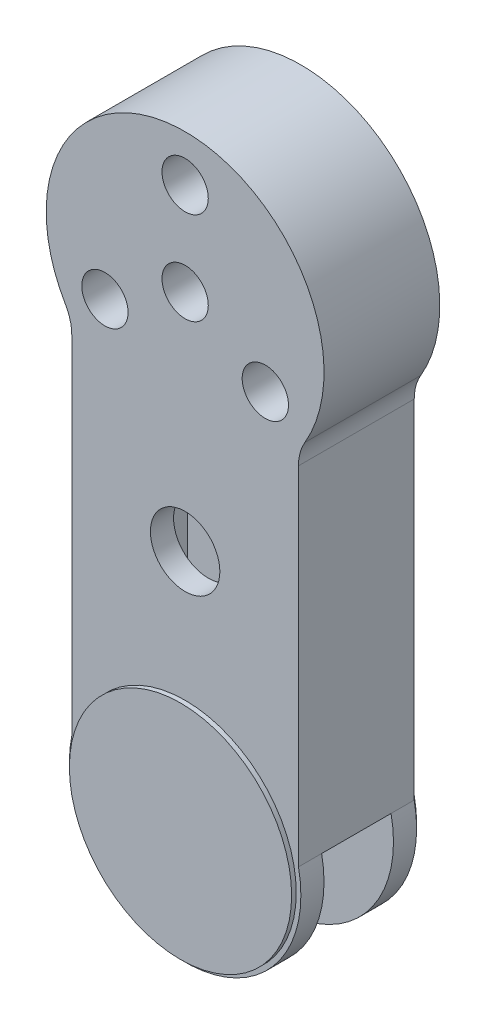
ISO-10303-21;
HEADER;
FILE_DESCRIPTION(('STEP AP214'),'2;1');
FILE_NAME('part.step','',(''),(''),'','','');
FILE_SCHEMA(('AUTOMOTIVE_DESIGN { 1 0 10303 214 1 1 1 1 }'));
ENDSEC;
DATA;
#1=APPLICATION_CONTEXT('core data for automotive mechanical design processes');
#2=APPLICATION_PROTOCOL_DEFINITION('international standard','automotive_design',2000,#1);
#3=PRODUCT_CONTEXT('',#1,'mechanical');
#4=PRODUCT('Part','Part','',(#3));
#5=PRODUCT_RELATED_PRODUCT_CATEGORY('part','',(#4));
#6=PRODUCT_DEFINITION_FORMATION('','',#4);
#7=PRODUCT_DEFINITION_CONTEXT('part definition',#1,'design');
#8=PRODUCT_DEFINITION('design','',#6,#7);
#9=PRODUCT_DEFINITION_SHAPE('','',#8);
#10=(LENGTH_UNIT() NAMED_UNIT(*) SI_UNIT(.MILLI.,.METRE.));
#11=(NAMED_UNIT(*) PLANE_ANGLE_UNIT() SI_UNIT($,.RADIAN.));
#12=(NAMED_UNIT(*) SI_UNIT($,.STERADIAN.) SOLID_ANGLE_UNIT());
#13=UNCERTAINTY_MEASURE_WITH_UNIT(LENGTH_MEASURE(1.E-05),#10,'distance_accuracy_value','');
#14=(GEOMETRIC_REPRESENTATION_CONTEXT(3) GLOBAL_UNCERTAINTY_ASSIGNED_CONTEXT((#13)) GLOBAL_UNIT_ASSIGNED_CONTEXT((#10,
#11,#12)) REPRESENTATION_CONTEXT('',''));
#15=CARTESIAN_POINT('',(0.,0.,0.));
#16=DIRECTION('',(0.,0.,1.));
#17=DIRECTION('',(1.,0.,0.));
#18=AXIS2_PLACEMENT_3D('',#15,#16,#17);
#19=CARTESIAN_POINT('',(0.,-200.720396700335,25.));
#20=DIRECTION('',(0.,0.,-1.));
#21=DIRECTION('',(-1.,0.,0.));
#22=AXIS2_PLACEMENT_3D('',#19,#20,#21);
#23=CYLINDRICAL_SURFACE('',#22,50.);
#24=CARTESIAN_POINT('',(0.,-200.720396700335,15.));
#25=DIRECTION('',(0.,0.,-1.));
#26=DIRECTION('',(-1.,0.,0.));
#27=AXIS2_PLACEMENT_3D('',#24,#25,#26);
#28=CIRCLE('',#27,50.);
#29=CARTESIAN_POINT('',(48.9615754368376,-190.583132239798,15.));
#30=VERTEX_POINT('',#29);
#31=CARTESIAN_POINT('',(-48.9615754368375,-190.583132239798,15.));
#32=VERTEX_POINT('',#31);
#33=EDGE_CURVE('E264',#30,#32,#28,.T.);
#34=ORIENTED_EDGE('',*,*,#33,.F.);
#35=DIRECTION('',(0.,0.,-1.));
#36=VECTOR('',#35,1.);
#37=CARTESIAN_POINT('',(48.9615754368376,-190.583132239798,25.));
#38=LINE('',#37,#36);
#39=CARTESIAN_POINT('',(48.9615754368376,-190.583132239798,25.));
#40=VERTEX_POINT('',#39);
#41=EDGE_CURVE('E153',#40,#30,#38,.T.);
#42=ORIENTED_EDGE('',*,*,#41,.F.);
#43=CARTESIAN_POINT('',(0.,-200.720396700335,25.));
#44=DIRECTION('',(0.,0.,1.));
#45=DIRECTION('',(-1.,0.,0.));
#46=AXIS2_PLACEMENT_3D('',#43,#44,#45);
#47=CIRCLE('',#46,50.);
#48=CARTESIAN_POINT('',(-48.9615754368375,-190.583132239798,25.));
#49=VERTEX_POINT('',#48);
#50=EDGE_CURVE('E115',#49,#40,#47,.T.);
#51=ORIENTED_EDGE('',*,*,#50,.F.);
#52=DIRECTION('',(0.,0.,-1.));
#53=VECTOR('',#52,1.);
#54=CARTESIAN_POINT('',(-48.9615754368375,-190.583132239798,25.));
#55=LINE('',#54,#53);
#56=EDGE_CURVE('E156',#49,#32,#55,.T.);
#57=ORIENTED_EDGE('',*,*,#56,.T.);
#58=EDGE_LOOP('',(#34,#42,#51,#57));
#59=FACE_BOUND('',#58,.T.);
#60=ADVANCED_FACE('F38',(#59),#23,.T.);
#61=CARTESIAN_POINT('',(-68.9615754368376,-40.549982900975,25.));
#62=DIRECTION('',(0.,0.,-1.));
#63=DIRECTION('',(-1.,0.,0.));
#64=AXIS2_PLACEMENT_3D('',#61,#62,#63);
#65=CYLINDRICAL_SURFACE('',#64,20.);
#66=CARTESIAN_POINT('',(-68.9615754368376,-40.549982900975,-25.));
#67=DIRECTION('',(0.,0.,-1.));
#68=DIRECTION('',(-1.,0.,0.));
#69=AXIS2_PLACEMENT_3D('',#66,#67,#68);
#70=CIRCLE('',#69,20.);
#71=CARTESIAN_POINT('',(-51.7211815776282,-30.4124871757312,-25.));
#72=VERTEX_POINT('',#71);
#73=CARTESIAN_POINT('',(-48.9615754368375,-40.549982900975,-25.));
#74=VERTEX_POINT('',#73);
#75=EDGE_CURVE('E136',#72,#74,#70,.T.);
#76=ORIENTED_EDGE('',*,*,#75,.T.);
#77=DIRECTION('',(0.,0.,-1.));
#78=VECTOR('',#77,1.);
#79=CARTESIAN_POINT('',(-48.9615754368375,-40.549982900975,25.));
#80=LINE('',#79,#78);
#81=CARTESIAN_POINT('',(-48.9615754368375,-40.549982900975,25.));
#82=VERTEX_POINT('',#81);
#83=EDGE_CURVE('E159',#82,#74,#80,.T.);
#84=ORIENTED_EDGE('',*,*,#83,.F.);
#85=CARTESIAN_POINT('',(-68.9615754368376,-40.549982900975,25.));
#86=DIRECTION('',(0.,0.,-1.));
#87=DIRECTION('',(-1.,0.,0.));
#88=AXIS2_PLACEMENT_3D('',#85,#86,#87);
#89=CIRCLE('',#88,20.);
#90=CARTESIAN_POINT('',(-51.7211815776282,-30.4124871757312,25.));
#91=VERTEX_POINT('',#90);
#92=EDGE_CURVE('E150',#91,#82,#89,.T.);
#93=ORIENTED_EDGE('',*,*,#92,.F.);
#94=DIRECTION('',(0.,0.,-1.));
#95=VECTOR('',#94,1.);
#96=CARTESIAN_POINT('',(-51.7211815776282,-30.4124871757312,25.));
#97=LINE('',#96,#95);
#98=EDGE_CURVE('E132',#91,#72,#97,.T.);
#99=ORIENTED_EDGE('',*,*,#98,.T.);
#100=EDGE_LOOP('',(#76,#84,#93,#99));
#101=FACE_BOUND('',#100,.T.);
#102=ADVANCED_FACE('F40',(#101),#65,.F.);
#103=CARTESIAN_POINT('',(-48.9615754368375,-40.549982900975,25.));
#104=DIRECTION('',(1.,0.,0.));
#105=DIRECTION('',(0.,0.,-1.));
#106=AXIS2_PLACEMENT_3D('',#103,#104,#105);
#107=PLANE('',#106);
#108=DIRECTION('',(0.,-1.,0.));
#109=VECTOR('',#108,1.);
#110=CARTESIAN_POINT('',(-48.9615754368375,-40.549982900975,-25.));
#111=LINE('',#110,#109);
#112=CARTESIAN_POINT('',(-48.9615754368375,-190.583132239798,-25.));
#113=VERTEX_POINT('',#112);
#114=EDGE_CURVE('E139',#74,#113,#111,.T.);
#115=ORIENTED_EDGE('',*,*,#114,.T.);
#116=CARTESIAN_POINT('',(-48.9615754368375,-190.583132239798,-15.));
#117=VERTEX_POINT('',#116);
#118=EDGE_CURVE('E155',#117,#113,#55,.T.);
#119=ORIENTED_EDGE('',*,*,#118,.F.);
#120=DIRECTION('',(0.,0.,1.));
#121=VECTOR('',#120,1.);
#122=CARTESIAN_POINT('',(-48.9615754368375,-190.583132239798,-15.));
#123=LINE('',#122,#121);
#124=EDGE_CURVE('E267',#117,#32,#123,.T.);
#125=ORIENTED_EDGE('',*,*,#124,.T.);
#126=ORIENTED_EDGE('',*,*,#56,.F.);
#127=DIRECTION('',(0.,-1.,0.));
#128=VECTOR('',#127,1.);
#129=CARTESIAN_POINT('',(-48.9615754368375,-40.549982900975,25.));
#130=LINE('',#129,#128);
#131=EDGE_CURVE('E98',#82,#49,#130,.T.);
#132=ORIENTED_EDGE('',*,*,#131,.F.);
#133=ORIENTED_EDGE('',*,*,#83,.T.);
#134=EDGE_LOOP('',(#115,#119,#125,#126,#132,#133));
#135=FACE_BOUND('',#134,.T.);
#136=ADVANCED_FACE('F297',(#135),#107,.F.);
#137=CARTESIAN_POINT('',(48.9615754368376,-190.583132239798,-15.));
#138=VERTEX_POINT('',#137);
#139=CARTESIAN_POINT('',(48.9615754368376,-190.583132239798,-25.));
#140=VERTEX_POINT('',#139);
#141=EDGE_CURVE('E127',#138,#140,#38,.T.);
#142=ORIENTED_EDGE('',*,*,#141,.F.);
#143=CARTESIAN_POINT('',(0.,-200.720396700335,-15.));
#144=DIRECTION('',(0.,0.,-1.));
#145=DIRECTION('',(-1.,0.,0.));
#146=AXIS2_PLACEMENT_3D('',#143,#144,#145);
#147=CIRCLE('',#146,50.);
#148=EDGE_CURVE('E140',#138,#117,#147,.T.);
#149=ORIENTED_EDGE('',*,*,#148,.T.);
#150=ORIENTED_EDGE('',*,*,#118,.T.);
#151=CARTESIAN_POINT('',(0.,-200.720396700335,-25.));
#152=DIRECTION('',(0.,0.,1.));
#153=DIRECTION('',(-1.,0.,0.));
#154=AXIS2_PLACEMENT_3D('',#151,#152,#153);
#155=CIRCLE('',#154,50.);
#156=EDGE_CURVE('E143',#113,#140,#155,.T.);
#157=ORIENTED_EDGE('',*,*,#156,.T.);
#158=EDGE_LOOP('',(#142,#149,#150,#157));
#159=FACE_BOUND('',#158,.T.);
#160=ADVANCED_FACE('F359',(#159),#23,.T.);
#161=CARTESIAN_POINT('',(48.9615754368376,-40.549982900975,25.));
#162=DIRECTION('',(-1.,0.,0.));
#163=DIRECTION('',(0.,0.,1.));
#164=AXIS2_PLACEMENT_3D('',#161,#162,#163);
#165=PLANE('',#164);
#166=DIRECTION('',(0.,1.,0.));
#167=VECTOR('',#166,1.);
#168=CARTESIAN_POINT('',(48.9615754368376,-40.549982900975,-25.));
#169=LINE('',#168,#167);
#170=CARTESIAN_POINT('',(48.9615754368376,-40.549982900975,-25.));
#171=VERTEX_POINT('',#170);
#172=EDGE_CURVE('E124',#140,#171,#169,.T.);
#173=ORIENTED_EDGE('',*,*,#172,.T.);
#174=DIRECTION('',(0.,0.,-1.));
#175=VECTOR('',#174,1.);
#176=CARTESIAN_POINT('',(48.9615754368376,-40.549982900975,25.));
#177=LINE('',#176,#175);
#178=CARTESIAN_POINT('',(48.9615754368376,-40.549982900975,25.));
#179=VERTEX_POINT('',#178);
#180=EDGE_CURVE('E121',#179,#171,#177,.T.);
#181=ORIENTED_EDGE('',*,*,#180,.F.);
#182=DIRECTION('',(0.,1.,0.));
#183=VECTOR('',#182,1.);
#184=CARTESIAN_POINT('',(48.9615754368376,-40.549982900975,25.));
#185=LINE('',#184,#183);
#186=EDGE_CURVE('E108',#40,#179,#185,.T.);
#187=ORIENTED_EDGE('',*,*,#186,.F.);
#188=ORIENTED_EDGE('',*,*,#41,.T.);
#189=DIRECTION('',(0.,0.,1.));
#190=VECTOR('',#189,1.);
#191=CARTESIAN_POINT('',(48.9615754368376,-190.583132239798,-15.));
#192=LINE('',#191,#190);
#193=EDGE_CURVE('E265',#138,#30,#192,.T.);
#194=ORIENTED_EDGE('',*,*,#193,.F.);
#195=ORIENTED_EDGE('',*,*,#141,.T.);
#196=EDGE_LOOP('',(#173,#181,#187,#188,#194,#195));
#197=FACE_BOUND('',#196,.T.);
#198=ADVANCED_FACE('F122',(#197),#165,.F.);
#199=CARTESIAN_POINT('',(68.9615754368376,-40.549982900975,25.));
#200=DIRECTION('',(0.,0.,-1.));
#201=DIRECTION('',(-1.,0.,0.));
#202=AXIS2_PLACEMENT_3D('',#199,#200,#201);
#203=CYLINDRICAL_SURFACE('',#202,20.);
#204=CARTESIAN_POINT('',(68.9615754368376,-40.549982900975,-25.));
#205=DIRECTION('',(0.,0.,-1.));
#206=DIRECTION('',(1.,0.,0.));
#207=AXIS2_PLACEMENT_3D('',#204,#205,#206);
#208=CIRCLE('',#207,20.);
#209=CARTESIAN_POINT('',(51.7211815776282,-30.4124871757312,-25.));
#210=VERTEX_POINT('',#209);
#211=EDGE_CURVE('E147',#171,#210,#208,.T.);
#212=ORIENTED_EDGE('',*,*,#211,.T.);
#213=DIRECTION('',(0.,0.,-1.));
#214=VECTOR('',#213,1.);
#215=CARTESIAN_POINT('',(51.7211815776282,-30.4124871757312,25.));
#216=LINE('',#215,#214);
#217=CARTESIAN_POINT('',(51.7211815776282,-30.4124871757312,25.));
#218=VERTEX_POINT('',#217);
#219=EDGE_CURVE('E128',#218,#210,#216,.T.);
#220=ORIENTED_EDGE('',*,*,#219,.F.);
#221=CARTESIAN_POINT('',(68.9615754368376,-40.549982900975,25.));
#222=DIRECTION('',(0.,0.,-1.));
#223=DIRECTION('',(1.,0.,0.));
#224=AXIS2_PLACEMENT_3D('',#221,#222,#223);
#225=CIRCLE('',#224,20.);
#226=EDGE_CURVE('E112',#179,#218,#225,.T.);
#227=ORIENTED_EDGE('',*,*,#226,.F.);
#228=ORIENTED_EDGE('',*,*,#180,.T.);
#229=EDGE_LOOP('',(#212,#220,#227,#228));
#230=FACE_BOUND('',#229,.T.);
#231=ADVANCED_FACE('F130',(#230),#203,.F.);
#232=CARTESIAN_POINT('',(0.,0.,25.));
#233=DIRECTION('',(0.,0.,-1.));
#234=DIRECTION('',(-1.,0.,0.));
#235=AXIS2_PLACEMENT_3D('',#232,#233,#234);
#236=CYLINDRICAL_SURFACE('',#235,60.);
#237=CARTESIAN_POINT('',(0.,0.,-25.));
#238=DIRECTION('',(0.,0.,1.));
#239=DIRECTION('',(1.,0.,0.));
#240=AXIS2_PLACEMENT_3D('',#237,#238,#239);
#241=CIRCLE('',#240,60.);
#242=EDGE_CURVE('E89',#210,#72,#241,.T.);
#243=ORIENTED_EDGE('',*,*,#242,.T.);
#244=ORIENTED_EDGE('',*,*,#98,.F.);
#245=CARTESIAN_POINT('',(0.,0.,25.));
#246=DIRECTION('',(0.,0.,1.));
#247=DIRECTION('',(1.,0.,0.));
#248=AXIS2_PLACEMENT_3D('',#245,#246,#247);
#249=CIRCLE('',#248,60.);
#250=EDGE_CURVE('E62',#218,#91,#249,.T.);
#251=ORIENTED_EDGE('',*,*,#250,.F.);
#252=ORIENTED_EDGE('',*,*,#219,.T.);
#253=EDGE_LOOP('',(#243,#244,#251,#252));
#254=FACE_BOUND('',#253,.T.);
#255=ADVANCED_FACE('F364',(#254),#236,.T.);
#256=CARTESIAN_POINT('',(-68.9615754368376,-40.549982900975,25.));
#257=DIRECTION('',(0.,0.,-1.));
#258=DIRECTION('',(-1.,0.,0.));
#259=AXIS2_PLACEMENT_3D('',#256,#257,#258);
#260=PLANE('',#259);
#261=CARTESIAN_POINT('',(0.,-97.0611570923179,25.));
#262=DIRECTION('',(0.,0.,1.));
#263=DIRECTION('',(1.,0.,0.));
#264=AXIS2_PLACEMENT_3D('',#261,#262,#263);
#265=CIRCLE('',#264,15.);
#266=CARTESIAN_POINT('',(15.,-97.0611570923179,25.));
#267=VERTEX_POINT('',#266);
#268=EDGE_CURVE('E165',#267,#267,#265,.T.);
#269=ORIENTED_EDGE('',*,*,#268,.F.);
#270=EDGE_LOOP('',(#269));
#271=FACE_BOUND('',#270,.T.);
#272=CARTESIAN_POINT('',(0.,-200.720396700335,25.));
#273=DIRECTION('',(0.,0.,-1.));
#274=DIRECTION('',(-1.,0.,0.));
#275=AXIS2_PLACEMENT_3D('',#272,#273,#274);
#276=CIRCLE('',#275,48.);
#277=CARTESIAN_POINT('',(-48.,-200.720396700335,25.));
#278=VERTEX_POINT('',#277);
#279=EDGE_CURVE('E46',#278,#278,#276,.F.);
#280=ORIENTED_EDGE('',*,*,#279,.F.);
#281=EDGE_LOOP('',(#280));
#282=FACE_BOUND('',#281,.T.);
#283=CARTESIAN_POINT('',(34.6410161513774,-20.0000000000002,25.));
#284=DIRECTION('',(0.,0.,1.));
#285=DIRECTION('',(1.,0.,0.));
#286=AXIS2_PLACEMENT_3D('',#283,#284,#285);
#287=CIRCLE('',#286,10.);
#288=CARTESIAN_POINT('',(44.6410161513774,-20.0000000000002,25.));
#289=VERTEX_POINT('',#288);
#290=EDGE_CURVE('E185',#289,#289,#287,.T.);
#291=ORIENTED_EDGE('',*,*,#290,.F.);
#292=EDGE_LOOP('',(#291));
#293=FACE_BOUND('',#292,.T.);
#294=CARTESIAN_POINT('',(0.,40.,25.));
#295=DIRECTION('',(0.,0.,1.));
#296=DIRECTION('',(1.,0.,0.));
#297=AXIS2_PLACEMENT_3D('',#294,#295,#296);
#298=CIRCLE('',#297,10.);
#299=CARTESIAN_POINT('',(10.,40.,25.));
#300=VERTEX_POINT('',#299);
#301=EDGE_CURVE('E192',#300,#300,#298,.T.);
#302=ORIENTED_EDGE('',*,*,#301,.F.);
#303=EDGE_LOOP('',(#302));
#304=FACE_BOUND('',#303,.T.);
#305=CARTESIAN_POINT('',(-34.6410161513774,-20.0000000000002,25.));
#306=DIRECTION('',(0.,0.,1.));
#307=DIRECTION('',(1.,0.,0.));
#308=AXIS2_PLACEMENT_3D('',#305,#306,#307);
#309=CIRCLE('',#308,10.);
#310=CARTESIAN_POINT('',(-24.6410161513774,-20.0000000000002,25.));
#311=VERTEX_POINT('',#310);
#312=EDGE_CURVE('E198',#311,#311,#309,.T.);
#313=ORIENTED_EDGE('',*,*,#312,.F.);
#314=EDGE_LOOP('',(#313));
#315=FACE_BOUND('',#314,.T.);
#316=CARTESIAN_POINT('',(0.,0.,25.));
#317=DIRECTION('',(0.,0.,1.));
#318=DIRECTION('',(1.,0.,0.));
#319=AXIS2_PLACEMENT_3D('',#316,#317,#318);
#320=CIRCLE('',#319,10.);
#321=CARTESIAN_POINT('',(10.,0.,25.));
#322=VERTEX_POINT('',#321);
#323=EDGE_CURVE('E188',#322,#322,#320,.T.);
#324=ORIENTED_EDGE('',*,*,#323,.F.);
#325=EDGE_LOOP('',(#324));
#326=FACE_BOUND('',#325,.T.);
#327=ORIENTED_EDGE('',*,*,#92,.T.);
#328=ORIENTED_EDGE('',*,*,#131,.T.);
#329=ORIENTED_EDGE('',*,*,#50,.T.);
#330=ORIENTED_EDGE('',*,*,#186,.T.);
#331=ORIENTED_EDGE('',*,*,#226,.T.);
#332=ORIENTED_EDGE('',*,*,#250,.T.);
#333=EDGE_LOOP('',(#327,#328,#329,#330,#331,#332));
#334=FACE_BOUND('',#333,.T.);
#335=ADVANCED_FACE('F110',(#271,#282,#293,#304,#315,#326,#334),#260,.F.);
#336=CARTESIAN_POINT('',(-68.9615754368376,-40.549982900975,-25.));
#337=DIRECTION('',(0.,0.,-1.));
#338=DIRECTION('',(-1.,0.,0.));
#339=AXIS2_PLACEMENT_3D('',#336,#337,#338);
#340=PLANE('',#339);
#341=CARTESIAN_POINT('',(0.,-200.720396700335,-25.));
#342=DIRECTION('',(0.,0.,-1.));
#343=DIRECTION('',(-1.,0.,0.));
#344=AXIS2_PLACEMENT_3D('',#341,#342,#343);
#345=CIRCLE('',#344,48.);
#346=CARTESIAN_POINT('',(-48.,-200.720396700335,-25.));
#347=VERTEX_POINT('',#346);
#348=EDGE_CURVE('E164',#347,#347,#345,.T.);
#349=ORIENTED_EDGE('',*,*,#348,.F.);
#350=EDGE_LOOP('',(#349));
#351=FACE_BOUND('',#350,.T.);
#352=CARTESIAN_POINT('',(34.6410161513774,-20.0000000000002,-25.));
#353=DIRECTION('',(0.,0.,1.));
#354=DIRECTION('',(1.,0.,0.));
#355=AXIS2_PLACEMENT_3D('',#352,#353,#354);
#356=CIRCLE('',#355,10.);
#357=CARTESIAN_POINT('',(44.6410161513774,-20.0000000000002,-25.));
#358=VERTEX_POINT('',#357);
#359=EDGE_CURVE('E189',#358,#358,#356,.T.);
#360=ORIENTED_EDGE('',*,*,#359,.T.);
#361=EDGE_LOOP('',(#360));
#362=FACE_BOUND('',#361,.T.);
#363=CARTESIAN_POINT('',(0.,40.,-25.));
#364=DIRECTION('',(0.,0.,1.));
#365=DIRECTION('',(1.,0.,0.));
#366=AXIS2_PLACEMENT_3D('',#363,#364,#365);
#367=CIRCLE('',#366,10.);
#368=CARTESIAN_POINT('',(10.,40.,-25.));
#369=VERTEX_POINT('',#368);
#370=EDGE_CURVE('E195',#369,#369,#367,.T.);
#371=ORIENTED_EDGE('',*,*,#370,.T.);
#372=EDGE_LOOP('',(#371));
#373=FACE_BOUND('',#372,.T.);
#374=CARTESIAN_POINT('',(-34.6410161513774,-20.0000000000002,-25.));
#375=DIRECTION('',(0.,0.,1.));
#376=DIRECTION('',(1.,0.,0.));
#377=AXIS2_PLACEMENT_3D('',#374,#375,#376);
#378=CIRCLE('',#377,10.);
#379=CARTESIAN_POINT('',(-24.6410161513774,-20.0000000000002,-25.));
#380=VERTEX_POINT('',#379);
#381=EDGE_CURVE('E184',#380,#380,#378,.T.);
#382=ORIENTED_EDGE('',*,*,#381,.T.);
#383=EDGE_LOOP('',(#382));
#384=FACE_BOUND('',#383,.T.);
#385=CARTESIAN_POINT('',(0.,0.,-25.));
#386=DIRECTION('',(0.,0.,1.));
#387=DIRECTION('',(1.,0.,0.));
#388=AXIS2_PLACEMENT_3D('',#385,#386,#387);
#389=CIRCLE('',#388,10.);
#390=CARTESIAN_POINT('',(10.,0.,-25.));
#391=VERTEX_POINT('',#390);
#392=EDGE_CURVE('E203',#391,#391,#389,.T.);
#393=ORIENTED_EDGE('',*,*,#392,.T.);
#394=EDGE_LOOP('',(#393));
#395=FACE_BOUND('',#394,.T.);
#396=ORIENTED_EDGE('',*,*,#75,.F.);
#397=ORIENTED_EDGE('',*,*,#242,.F.);
#398=ORIENTED_EDGE('',*,*,#211,.F.);
#399=ORIENTED_EDGE('',*,*,#172,.F.);
#400=ORIENTED_EDGE('',*,*,#156,.F.);
#401=ORIENTED_EDGE('',*,*,#114,.F.);
#402=EDGE_LOOP('',(#396,#397,#398,#399,#400,#401));
#403=FACE_BOUND('',#402,.T.);
#404=ADVANCED_FACE('F363',(#351,#362,#373,#384,#395,#403),#340,.T.);
#405=CARTESIAN_POINT('',(58.9615754368376,-172.298860992336,-15.));
#406=DIRECTION('',(0.,0.,-1.));
#407=DIRECTION('',(-1.,0.,0.));
#408=AXIS2_PLACEMENT_3D('',#405,#406,#407);
#409=PLANE('',#408);
#410=CARTESIAN_POINT('',(0.,-200.720396700335,-15.));
#411=DIRECTION('',(0.,0.,-1.));
#412=DIRECTION('',(-1.,0.,0.));
#413=AXIS2_PLACEMENT_3D('',#410,#411,#412);
#414=CIRCLE('',#413,10.);
#415=CARTESIAN_POINT('',(-10.,-200.720396700335,-15.));
#416=VERTEX_POINT('',#415);
#417=EDGE_CURVE('E11',#416,#416,#414,.F.);
#418=ORIENTED_EDGE('',*,*,#417,.F.);
#419=EDGE_LOOP('',(#418));
#420=FACE_BOUND('',#419,.T.);
#421=DIRECTION('',(-0.707106781186545,0.70710678118655,0.));
#422=VECTOR('',#421,1.);
#423=CARTESIAN_POINT('',(44.8194398131066,-186.440996616067,-15.));
#424=LINE('',#423,#422);
#425=CARTESIAN_POINT('',(44.8194398131066,-186.440996616067,-15.));
#426=VERTEX_POINT('',#425);
#427=EDGE_CURVE('E53',#138,#426,#424,.T.);
#428=ORIENTED_EDGE('',*,*,#427,.T.);
#429=CARTESIAN_POINT('',(58.9615754368376,-172.298860992336,-15.));
#430=DIRECTION('',(0.,0.,-1.));
#431=DIRECTION('',(-1.,0.,0.));
#432=AXIS2_PLACEMENT_3D('',#429,#430,#431);
#433=CIRCLE('',#432,20.);
#434=CARTESIAN_POINT('',(38.9615754368376,-172.298860992336,-15.));
#435=VERTEX_POINT('',#434);
#436=EDGE_CURVE('E209',#426,#435,#433,.T.);
#437=ORIENTED_EDGE('',*,*,#436,.T.);
#438=DIRECTION('',(0.,1.,0.));
#439=VECTOR('',#438,1.);
#440=CARTESIAN_POINT('',(38.9615754368376,-172.298860992336,-15.));
#441=LINE('',#440,#439);
#442=CARTESIAN_POINT('',(38.9615754368376,-60.549982900975,-15.));
#443=VERTEX_POINT('',#442);
#444=EDGE_CURVE('E212',#435,#443,#441,.T.);
#445=ORIENTED_EDGE('',*,*,#444,.T.);
#446=CARTESIAN_POINT('',(28.9615754368376,-60.549982900975,-15.));
#447=DIRECTION('',(0.,0.,1.));
#448=DIRECTION('',(1.,0.,0.));
#449=AXIS2_PLACEMENT_3D('',#446,#447,#448);
#450=CIRCLE('',#449,10.);
#451=CARTESIAN_POINT('',(28.9615754368375,-50.549982900975,-15.));
#452=VERTEX_POINT('',#451);
#453=EDGE_CURVE('E216',#443,#452,#450,.T.);
#454=ORIENTED_EDGE('',*,*,#453,.T.);
#455=DIRECTION('',(-1.,0.,0.));
#456=VECTOR('',#455,1.);
#457=CARTESIAN_POINT('',(-28.9615754368375,-50.549982900975,-15.));
#458=LINE('',#457,#456);
#459=CARTESIAN_POINT('',(-28.9615754368375,-50.549982900975,-15.));
#460=VERTEX_POINT('',#459);
#461=EDGE_CURVE('E219',#452,#460,#458,.T.);
#462=ORIENTED_EDGE('',*,*,#461,.T.);
#463=CARTESIAN_POINT('',(-28.9615754368375,-60.549982900975,-15.));
#464=DIRECTION('',(0.,0.,1.));
#465=DIRECTION('',(-1.,0.,0.));
#466=AXIS2_PLACEMENT_3D('',#463,#464,#465);
#467=CIRCLE('',#466,10.);
#468=CARTESIAN_POINT('',(-38.9615754368375,-60.549982900975,-15.));
#469=VERTEX_POINT('',#468);
#470=EDGE_CURVE('E222',#460,#469,#467,.T.);
#471=ORIENTED_EDGE('',*,*,#470,.T.);
#472=DIRECTION('',(0.,-1.,0.));
#473=VECTOR('',#472,1.);
#474=CARTESIAN_POINT('',(-38.9615754368375,-172.298860992336,-15.));
#475=LINE('',#474,#473);
#476=CARTESIAN_POINT('',(-38.9615754368375,-172.298860992336,-15.));
#477=VERTEX_POINT('',#476);
#478=EDGE_CURVE('E225',#469,#477,#475,.T.);
#479=ORIENTED_EDGE('',*,*,#478,.T.);
#480=CARTESIAN_POINT('',(-58.9615754368375,-172.298860992336,-15.));
#481=DIRECTION('',(0.,0.,-1.));
#482=DIRECTION('',(-1.,0.,0.));
#483=AXIS2_PLACEMENT_3D('',#480,#481,#482);
#484=CIRCLE('',#483,20.);
#485=CARTESIAN_POINT('',(-44.8194398131066,-186.440996616067,-15.));
#486=VERTEX_POINT('',#485);
#487=EDGE_CURVE('E228',#477,#486,#484,.T.);
#488=ORIENTED_EDGE('',*,*,#487,.T.);
#489=DIRECTION('',(-0.707106781186547,-0.707106781186547,0.));
#490=VECTOR('',#489,1.);
#491=CARTESIAN_POINT('',(-48.9615754368375,-190.583132239798,-15.));
#492=LINE('',#491,#490);
#493=EDGE_CURVE('E231',#486,#117,#492,.T.);
#494=ORIENTED_EDGE('',*,*,#493,.T.);
#495=ORIENTED_EDGE('',*,*,#148,.F.);
#496=EDGE_LOOP('',(#428,#437,#445,#454,#462,#471,#479,#488,#494,#495));
#497=FACE_BOUND('',#496,.T.);
#498=ADVANCED_FACE('F355',(#420,#497),#409,.F.);
#499=CARTESIAN_POINT('',(58.9615754368376,-172.298860992336,15.));
#500=DIRECTION('',(0.,0.,-1.));
#501=DIRECTION('',(-1.,0.,0.));
#502=AXIS2_PLACEMENT_3D('',#499,#500,#501);
#503=PLANE('',#502);
#504=CARTESIAN_POINT('',(0.,-200.720396700335,15.));
#505=DIRECTION('',(0.,0.,-1.));
#506=DIRECTION('',(-1.,0.,0.));
#507=AXIS2_PLACEMENT_3D('',#504,#505,#506);
#508=CIRCLE('',#507,10.);
#509=CARTESIAN_POINT('',(-10.,-200.720396700335,15.));
#510=VERTEX_POINT('',#509);
#511=EDGE_CURVE('E172',#510,#510,#508,.T.);
#512=ORIENTED_EDGE('',*,*,#511,.F.);
#513=EDGE_LOOP('',(#512));
#514=FACE_BOUND('',#513,.T.);
#515=CARTESIAN_POINT('',(0.,-97.0611570923179,15.));
#516=DIRECTION('',(0.,0.,-1.));
#517=DIRECTION('',(-1.,0.,0.));
#518=AXIS2_PLACEMENT_3D('',#515,#516,#517);
#519=CIRCLE('',#518,15.);
#520=CARTESIAN_POINT('',(-15.,-97.0611570923179,15.));
#521=VERTEX_POINT('',#520);
#522=EDGE_CURVE('E162',#521,#521,#519,.T.);
#523=ORIENTED_EDGE('',*,*,#522,.F.);
#524=EDGE_LOOP('',(#523));
#525=FACE_BOUND('',#524,.T.);
#526=ORIENTED_EDGE('',*,*,#33,.T.);
#527=DIRECTION('',(-0.707106781186547,-0.707106781186547,0.));
#528=VECTOR('',#527,1.);
#529=CARTESIAN_POINT('',(-48.9615754368375,-190.583132239798,15.));
#530=LINE('',#529,#528);
#531=CARTESIAN_POINT('',(-44.8194398131066,-186.440996616067,15.));
#532=VERTEX_POINT('',#531);
#533=EDGE_CURVE('E256',#532,#32,#530,.T.);
#534=ORIENTED_EDGE('',*,*,#533,.F.);
#535=CARTESIAN_POINT('',(-58.9615754368375,-172.298860992336,15.));
#536=DIRECTION('',(0.,0.,-1.));
#537=DIRECTION('',(-1.,0.,0.));
#538=AXIS2_PLACEMENT_3D('',#535,#536,#537);
#539=CIRCLE('',#538,20.);
#540=CARTESIAN_POINT('',(-38.9615754368375,-172.298860992336,15.));
#541=VERTEX_POINT('',#540);
#542=EDGE_CURVE('E253',#541,#532,#539,.T.);
#543=ORIENTED_EDGE('',*,*,#542,.F.);
#544=DIRECTION('',(0.,-1.,0.));
#545=VECTOR('',#544,1.);
#546=CARTESIAN_POINT('',(-38.9615754368375,-172.298860992336,15.));
#547=LINE('',#546,#545);
#548=CARTESIAN_POINT('',(-38.9615754368375,-60.549982900975,15.));
#549=VERTEX_POINT('',#548);
#550=EDGE_CURVE('E250',#549,#541,#547,.T.);
#551=ORIENTED_EDGE('',*,*,#550,.F.);
#552=CARTESIAN_POINT('',(-28.9615754368375,-60.549982900975,15.));
#553=DIRECTION('',(0.,0.,1.));
#554=DIRECTION('',(-1.,0.,0.));
#555=AXIS2_PLACEMENT_3D('',#552,#553,#554);
#556=CIRCLE('',#555,10.);
#557=CARTESIAN_POINT('',(-28.9615754368375,-50.549982900975,15.));
#558=VERTEX_POINT('',#557);
#559=EDGE_CURVE('E247',#558,#549,#556,.T.);
#560=ORIENTED_EDGE('',*,*,#559,.F.);
#561=DIRECTION('',(-1.,0.,0.));
#562=VECTOR('',#561,1.);
#563=CARTESIAN_POINT('',(-28.9615754368375,-50.549982900975,15.));
#564=LINE('',#563,#562);
#565=CARTESIAN_POINT('',(28.9615754368375,-50.549982900975,15.));
#566=VERTEX_POINT('',#565);
#567=EDGE_CURVE('E244',#566,#558,#564,.T.);
#568=ORIENTED_EDGE('',*,*,#567,.F.);
#569=CARTESIAN_POINT('',(28.9615754368376,-60.549982900975,15.));
#570=DIRECTION('',(0.,0.,1.));
#571=DIRECTION('',(1.,0.,0.));
#572=AXIS2_PLACEMENT_3D('',#569,#570,#571);
#573=CIRCLE('',#572,10.);
#574=CARTESIAN_POINT('',(38.9615754368376,-60.549982900975,15.));
#575=VERTEX_POINT('',#574);
#576=EDGE_CURVE('E241',#575,#566,#573,.T.);
#577=ORIENTED_EDGE('',*,*,#576,.F.);
#578=DIRECTION('',(0.,1.,0.));
#579=VECTOR('',#578,1.);
#580=CARTESIAN_POINT('',(38.9615754368376,-172.298860992336,15.));
#581=LINE('',#580,#579);
#582=CARTESIAN_POINT('',(38.9615754368376,-172.298860992336,15.));
#583=VERTEX_POINT('',#582);
#584=EDGE_CURVE('E238',#583,#575,#581,.T.);
#585=ORIENTED_EDGE('',*,*,#584,.F.);
#586=CARTESIAN_POINT('',(58.9615754368376,-172.298860992336,15.));
#587=DIRECTION('',(0.,0.,-1.));
#588=DIRECTION('',(-1.,0.,0.));
#589=AXIS2_PLACEMENT_3D('',#586,#587,#588);
#590=CIRCLE('',#589,20.);
#591=CARTESIAN_POINT('',(44.8194398131066,-186.440996616067,15.));
#592=VERTEX_POINT('',#591);
#593=EDGE_CURVE('E206',#592,#583,#590,.T.);
#594=ORIENTED_EDGE('',*,*,#593,.F.);
#595=DIRECTION('',(-0.707106781186545,0.70710678118655,0.));
#596=VECTOR('',#595,1.);
#597=CARTESIAN_POINT('',(44.8194398131066,-186.440996616067,15.));
#598=LINE('',#597,#596);
#599=EDGE_CURVE('E213',#30,#592,#598,.T.);
#600=ORIENTED_EDGE('',*,*,#599,.F.);
#601=EDGE_LOOP('',(#526,#534,#543,#551,#560,#568,#577,#585,#594,#600));
#602=FACE_BOUND('',#601,.T.);
#603=ADVANCED_FACE('F395',(#514,#525,#602),#503,.T.);
#604=CARTESIAN_POINT('',(58.9615754368376,-172.298860992336,-15.));
#605=DIRECTION('',(0.,0.,1.));
#606=DIRECTION('',(1.,0.,0.));
#607=AXIS2_PLACEMENT_3D('',#604,#605,#606);
#608=CYLINDRICAL_SURFACE('',#607,20.);
#609=ORIENTED_EDGE('',*,*,#593,.T.);
#610=DIRECTION('',(0.,0.,1.));
#611=VECTOR('',#610,1.);
#612=CARTESIAN_POINT('',(38.9615754368376,-172.298860992336,-15.));
#613=LINE('',#612,#611);
#614=EDGE_CURVE('E235',#435,#583,#613,.T.);
#615=ORIENTED_EDGE('',*,*,#614,.F.);
#616=ORIENTED_EDGE('',*,*,#436,.F.);
#617=DIRECTION('',(0.,0.,1.));
#618=VECTOR('',#617,1.);
#619=CARTESIAN_POINT('',(44.8194398131066,-186.440996616067,-15.));
#620=LINE('',#619,#618);
#621=EDGE_CURVE('E261',#426,#592,#620,.T.);
#622=ORIENTED_EDGE('',*,*,#621,.T.);
#623=EDGE_LOOP('',(#609,#615,#616,#622));
#624=FACE_BOUND('',#623,.T.);
#625=ADVANCED_FACE('F348',(#624),#608,.T.);
#626=CARTESIAN_POINT('',(44.8194398131066,-186.440996616067,-15.));
#627=DIRECTION('',(0.70710678118655,0.707106781186545,0.));
#628=DIRECTION('',(-0.707106781186545,0.70710678118655,0.));
#629=AXIS2_PLACEMENT_3D('',#626,#627,#628);
#630=PLANE('',#629);
#631=ORIENTED_EDGE('',*,*,#599,.T.);
#632=ORIENTED_EDGE('',*,*,#621,.F.);
#633=ORIENTED_EDGE('',*,*,#427,.F.);
#634=ORIENTED_EDGE('',*,*,#193,.T.);
#635=EDGE_LOOP('',(#631,#632,#633,#634));
#636=FACE_BOUND('',#635,.T.);
#637=ADVANCED_FACE('F394',(#636),#630,.F.);
#638=CARTESIAN_POINT('',(-48.9615754368375,-190.583132239798,-15.));
#639=DIRECTION('',(-0.707106781186547,0.707106781186547,0.));
#640=DIRECTION('',(-0.707106781186548,-0.707106781186548,0.));
#641=AXIS2_PLACEMENT_3D('',#638,#639,#640);
#642=PLANE('',#641);
#643=ORIENTED_EDGE('',*,*,#533,.T.);
#644=ORIENTED_EDGE('',*,*,#124,.F.);
#645=ORIENTED_EDGE('',*,*,#493,.F.);
#646=DIRECTION('',(0.,0.,1.));
#647=VECTOR('',#646,1.);
#648=CARTESIAN_POINT('',(-44.8194398131066,-186.440996616067,-15.));
#649=LINE('',#648,#647);
#650=EDGE_CURVE('E270',#486,#532,#649,.T.);
#651=ORIENTED_EDGE('',*,*,#650,.T.);
#652=EDGE_LOOP('',(#643,#644,#645,#651));
#653=FACE_BOUND('',#652,.T.);
#654=ADVANCED_FACE('F418',(#653),#642,.F.);
#655=CARTESIAN_POINT('',(-58.9615754368375,-172.298860992336,-15.));
#656=DIRECTION('',(0.,0.,1.));
#657=DIRECTION('',(1.,0.,0.));
#658=AXIS2_PLACEMENT_3D('',#655,#656,#657);
#659=CYLINDRICAL_SURFACE('',#658,20.);
#660=ORIENTED_EDGE('',*,*,#542,.T.);
#661=ORIENTED_EDGE('',*,*,#650,.F.);
#662=ORIENTED_EDGE('',*,*,#487,.F.);
#663=DIRECTION('',(0.,0.,1.));
#664=VECTOR('',#663,1.);
#665=CARTESIAN_POINT('',(-38.9615754368375,-172.298860992336,-15.));
#666=LINE('',#665,#664);
#667=EDGE_CURVE('E273',#477,#541,#666,.T.);
#668=ORIENTED_EDGE('',*,*,#667,.T.);
#669=EDGE_LOOP('',(#660,#661,#662,#668));
#670=FACE_BOUND('',#669,.T.);
#671=ADVANCED_FACE('F414',(#670),#659,.T.);
#672=CARTESIAN_POINT('',(-38.9615754368375,-172.298860992336,-15.));
#673=DIRECTION('',(-1.,0.,0.));
#674=DIRECTION('',(0.,0.,1.));
#675=AXIS2_PLACEMENT_3D('',#672,#673,#674);
#676=PLANE('',#675);
#677=ORIENTED_EDGE('',*,*,#550,.T.);
#678=ORIENTED_EDGE('',*,*,#667,.F.);
#679=ORIENTED_EDGE('',*,*,#478,.F.);
#680=DIRECTION('',(0.,0.,1.));
#681=VECTOR('',#680,1.);
#682=CARTESIAN_POINT('',(-38.9615754368375,-60.549982900975,-15.));
#683=LINE('',#682,#681);
#684=EDGE_CURVE('E276',#469,#549,#683,.T.);
#685=ORIENTED_EDGE('',*,*,#684,.T.);
#686=EDGE_LOOP('',(#677,#678,#679,#685));
#687=FACE_BOUND('',#686,.T.);
#688=ADVANCED_FACE('F410',(#687),#676,.F.);
#689=CARTESIAN_POINT('',(-28.9615754368375,-60.549982900975,-15.));
#690=DIRECTION('',(0.,0.,1.));
#691=DIRECTION('',(1.,0.,0.));
#692=AXIS2_PLACEMENT_3D('',#689,#690,#691);
#693=CYLINDRICAL_SURFACE('',#692,10.);
#694=ORIENTED_EDGE('',*,*,#559,.T.);
#695=ORIENTED_EDGE('',*,*,#684,.F.);
#696=ORIENTED_EDGE('',*,*,#470,.F.);
#697=DIRECTION('',(0.,0.,1.));
#698=VECTOR('',#697,1.);
#699=CARTESIAN_POINT('',(-28.9615754368375,-50.549982900975,-15.));
#700=LINE('',#699,#698);
#701=EDGE_CURVE('E279',#460,#558,#700,.T.);
#702=ORIENTED_EDGE('',*,*,#701,.T.);
#703=EDGE_LOOP('',(#694,#695,#696,#702));
#704=FACE_BOUND('',#703,.T.);
#705=ADVANCED_FACE('F406',(#704),#693,.F.);
#706=CARTESIAN_POINT('',(-28.9615754368375,-50.549982900975,-15.));
#707=DIRECTION('',(0.,1.,0.));
#708=DIRECTION('',(-1.,0.,0.));
#709=AXIS2_PLACEMENT_3D('',#706,#707,#708);
#710=PLANE('',#709);
#711=ORIENTED_EDGE('',*,*,#567,.T.);
#712=ORIENTED_EDGE('',*,*,#701,.F.);
#713=ORIENTED_EDGE('',*,*,#461,.F.);
#714=DIRECTION('',(0.,0.,1.));
#715=VECTOR('',#714,1.);
#716=CARTESIAN_POINT('',(28.9615754368375,-50.549982900975,-15.));
#717=LINE('',#716,#715);
#718=EDGE_CURVE('E282',#452,#566,#717,.T.);
#719=ORIENTED_EDGE('',*,*,#718,.T.);
#720=EDGE_LOOP('',(#711,#712,#713,#719));
#721=FACE_BOUND('',#720,.T.);
#722=ADVANCED_FACE('F402',(#721),#710,.F.);
#723=CARTESIAN_POINT('',(28.9615754368376,-60.549982900975,-15.));
#724=DIRECTION('',(0.,0.,1.));
#725=DIRECTION('',(1.,0.,0.));
#726=AXIS2_PLACEMENT_3D('',#723,#724,#725);
#727=CYLINDRICAL_SURFACE('',#726,10.);
#728=ORIENTED_EDGE('',*,*,#576,.T.);
#729=ORIENTED_EDGE('',*,*,#718,.F.);
#730=ORIENTED_EDGE('',*,*,#453,.F.);
#731=DIRECTION('',(0.,0.,1.));
#732=VECTOR('',#731,1.);
#733=CARTESIAN_POINT('',(38.9615754368376,-60.549982900975,-15.));
#734=LINE('',#733,#732);
#735=EDGE_CURVE('E285',#443,#575,#734,.T.);
#736=ORIENTED_EDGE('',*,*,#735,.T.);
#737=EDGE_LOOP('',(#728,#729,#730,#736));
#738=FACE_BOUND('',#737,.T.);
#739=ADVANCED_FACE('F399',(#738),#727,.F.);
#740=CARTESIAN_POINT('',(38.9615754368376,-172.298860992336,-15.));
#741=DIRECTION('',(1.,0.,0.));
#742=DIRECTION('',(0.,1.,0.));
#743=AXIS2_PLACEMENT_3D('',#740,#741,#742);
#744=PLANE('',#743);
#745=ORIENTED_EDGE('',*,*,#584,.T.);
#746=ORIENTED_EDGE('',*,*,#735,.F.);
#747=ORIENTED_EDGE('',*,*,#444,.F.);
#748=ORIENTED_EDGE('',*,*,#614,.T.);
#749=EDGE_LOOP('',(#745,#746,#747,#748));
#750=FACE_BOUND('',#749,.T.);
#751=ADVANCED_FACE('F352',(#750),#744,.F.);
#752=CARTESIAN_POINT('',(0.,0.,-25.));
#753=DIRECTION('',(0.,0.,1.));
#754=DIRECTION('',(1.,0.,0.));
#755=AXIS2_PLACEMENT_3D('',#752,#753,#754);
#756=CYLINDRICAL_SURFACE('',#755,10.);
#757=ORIENTED_EDGE('',*,*,#392,.F.);
#758=EDGE_LOOP('',(#757));
#759=FACE_BOUND('',#758,.T.);
#760=ORIENTED_EDGE('',*,*,#323,.T.);
#761=EDGE_LOOP('',(#760));
#762=FACE_BOUND('',#761,.T.);
#763=ADVANCED_FACE('F398',(#759,#762),#756,.F.);
#764=CARTESIAN_POINT('',(-34.6410161513774,-20.0000000000002,-25.));
#765=DIRECTION('',(0.,0.,1.));
#766=DIRECTION('',(1.,0.,0.));
#767=AXIS2_PLACEMENT_3D('',#764,#765,#766);
#768=CYLINDRICAL_SURFACE('',#767,10.);
#769=ORIENTED_EDGE('',*,*,#381,.F.);
#770=EDGE_LOOP('',(#769));
#771=FACE_BOUND('',#770,.T.);
#772=ORIENTED_EDGE('',*,*,#312,.T.);
#773=EDGE_LOOP('',(#772));
#774=FACE_BOUND('',#773,.T.);
#775=ADVANCED_FACE('F433',(#771,#774),#768,.F.);
#776=CARTESIAN_POINT('',(0.,40.,-25.));
#777=DIRECTION('',(0.,0.,1.));
#778=DIRECTION('',(1.,0.,0.));
#779=AXIS2_PLACEMENT_3D('',#776,#777,#778);
#780=CYLINDRICAL_SURFACE('',#779,10.);
#781=ORIENTED_EDGE('',*,*,#370,.F.);
#782=EDGE_LOOP('',(#781));
#783=FACE_BOUND('',#782,.T.);
#784=ORIENTED_EDGE('',*,*,#301,.T.);
#785=EDGE_LOOP('',(#784));
#786=FACE_BOUND('',#785,.T.);
#787=ADVANCED_FACE('F437',(#783,#786),#780,.F.);
#788=CARTESIAN_POINT('',(34.6410161513774,-20.0000000000002,-25.));
#789=DIRECTION('',(0.,0.,1.));
#790=DIRECTION('',(1.,0.,0.));
#791=AXIS2_PLACEMENT_3D('',#788,#789,#790);
#792=CYLINDRICAL_SURFACE('',#791,10.);
#793=ORIENTED_EDGE('',*,*,#359,.F.);
#794=EDGE_LOOP('',(#793));
#795=FACE_BOUND('',#794,.T.);
#796=ORIENTED_EDGE('',*,*,#290,.T.);
#797=EDGE_LOOP('',(#796));
#798=FACE_BOUND('',#797,.T.);
#799=ADVANCED_FACE('F441',(#795,#798),#792,.F.);
#800=CARTESIAN_POINT('',(0.,-200.720396700335,27.));
#801=DIRECTION('',(0.,0.,-1.));
#802=DIRECTION('',(-1.,0.,0.));
#803=AXIS2_PLACEMENT_3D('',#800,#801,#802);
#804=CYLINDRICAL_SURFACE('',#803,48.);
#805=CARTESIAN_POINT('',(0.,-200.720396700335,27.));
#806=DIRECTION('',(0.,0.,1.));
#807=DIRECTION('',(1.,0.,0.));
#808=AXIS2_PLACEMENT_3D('',#805,#806,#807);
#809=CIRCLE('',#808,48.);
#810=CARTESIAN_POINT('',(48.,-200.720396700335,27.));
#811=VERTEX_POINT('',#810);
#812=EDGE_CURVE('E180',#811,#811,#809,.T.);
#813=ORIENTED_EDGE('',*,*,#812,.F.);
#814=EDGE_LOOP('',(#813));
#815=FACE_BOUND('',#814,.T.);
#816=ORIENTED_EDGE('',*,*,#279,.T.);
#817=EDGE_LOOP('',(#816));
#818=FACE_BOUND('',#817,.T.);
#819=ADVANCED_FACE('F445',(#815,#818),#804,.T.);
#820=CARTESIAN_POINT('',(0.,-200.720396700335,27.));
#821=DIRECTION('',(0.,0.,1.));
#822=DIRECTION('',(1.,0.,0.));
#823=AXIS2_PLACEMENT_3D('',#820,#821,#822);
#824=PLANE('',#823);
#825=ORIENTED_EDGE('',*,*,#812,.T.);
#826=EDGE_LOOP('',(#825));
#827=FACE_BOUND('',#826,.T.);
#828=ADVANCED_FACE('F449',(#827),#824,.T.);
#829=CARTESIAN_POINT('',(0.,-200.720396700335,-27.));
#830=DIRECTION('',(0.,0.,1.));
#831=DIRECTION('',(1.,0.,0.));
#832=AXIS2_PLACEMENT_3D('',#829,#830,#831);
#833=CYLINDRICAL_SURFACE('',#832,48.);
#834=CARTESIAN_POINT('',(0.,-200.720396700335,-27.));
#835=DIRECTION('',(0.,0.,-1.));
#836=DIRECTION('',(-1.,0.,0.));
#837=AXIS2_PLACEMENT_3D('',#834,#835,#836);
#838=CIRCLE('',#837,48.);
#839=CARTESIAN_POINT('',(-48.,-200.720396700335,-27.));
#840=VERTEX_POINT('',#839);
#841=EDGE_CURVE('E169',#840,#840,#838,.T.);
#842=ORIENTED_EDGE('',*,*,#841,.F.);
#843=EDGE_LOOP('',(#842));
#844=FACE_BOUND('',#843,.T.);
#845=ORIENTED_EDGE('',*,*,#348,.T.);
#846=EDGE_LOOP('',(#845));
#847=FACE_BOUND('',#846,.T.);
#848=ADVANCED_FACE('F453',(#844,#847),#833,.T.);
#849=CARTESIAN_POINT('',(0.,-200.720396700335,-27.));
#850=DIRECTION('',(0.,0.,-1.));
#851=DIRECTION('',(-1.,0.,0.));
#852=AXIS2_PLACEMENT_3D('',#849,#850,#851);
#853=PLANE('',#852);
#854=ORIENTED_EDGE('',*,*,#841,.T.);
#855=EDGE_LOOP('',(#854));
#856=FACE_BOUND('',#855,.T.);
#857=ADVANCED_FACE('F457',(#856),#853,.T.);
#858=CARTESIAN_POINT('',(0.,-97.0611570923179,5.));
#859=DIRECTION('',(0.,0.,1.));
#860=DIRECTION('',(1.,0.,0.));
#861=AXIS2_PLACEMENT_3D('',#858,#859,#860);
#862=CYLINDRICAL_SURFACE('',#861,15.);
#863=ORIENTED_EDGE('',*,*,#522,.T.);
#864=EDGE_LOOP('',(#863));
#865=FACE_BOUND('',#864,.T.);
#866=ORIENTED_EDGE('',*,*,#268,.T.);
#867=EDGE_LOOP('',(#866));
#868=FACE_BOUND('',#867,.T.);
#869=ADVANCED_FACE('F461',(#865,#868),#862,.F.);
#870=CARTESIAN_POINT('',(0.,-200.720396700335,43.2842712474619));
#871=DIRECTION('',(0.,0.,-1.));
#872=DIRECTION('',(-1.,0.,0.));
#873=AXIS2_PLACEMENT_3D('',#870,#871,#872);
#874=CYLINDRICAL_SURFACE('',#873,10.);
#875=ORIENTED_EDGE('',*,*,#511,.T.);
#876=EDGE_LOOP('',(#875));
#877=FACE_BOUND('',#876,.T.);
#878=ORIENTED_EDGE('',*,*,#417,.T.);
#879=EDGE_LOOP('',(#878));
#880=FACE_BOUND('',#879,.T.);
#881=ADVANCED_FACE('F465',(#877,#880),#874,.T.);
#882=CLOSED_SHELL('',(#60,#102,#136,#160,#198,#231,#255,#335,#404,#498,#603,#625,#637,#654,#671,
#688,#705,#722,#739,#751,#763,#775,#787,#799,#819,#828,#848,#857,#869,#881));
#883=MANIFOLD_SOLID_BREP('B2',#882);
#884=ADVANCED_BREP_SHAPE_REPRESENTATION('',(#18,#883),#14);
#885=SHAPE_DEFINITION_REPRESENTATION(#9,#884);
ENDSEC;
END-ISO-10303-21;
